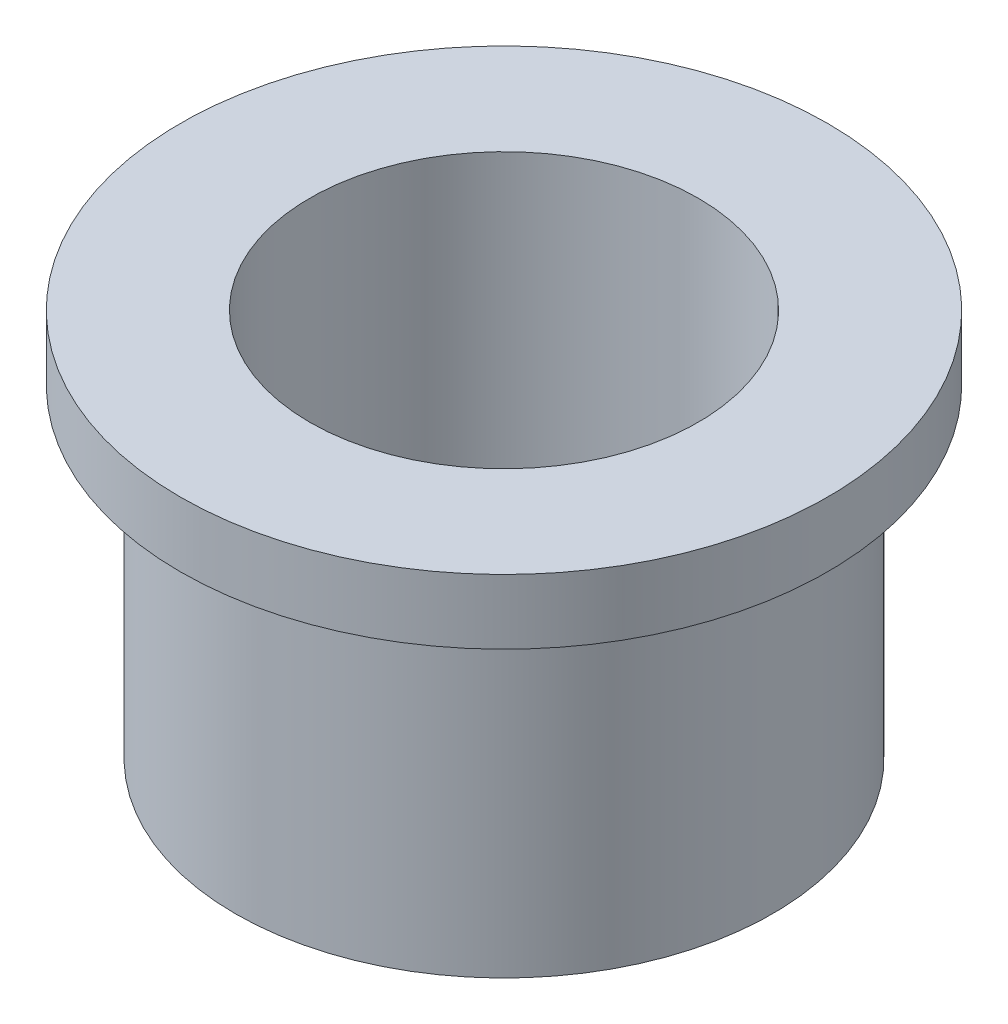
ISO-10303-21;
HEADER;
FILE_DESCRIPTION(('STEP AP214'),'2;1');
FILE_NAME('part.step','',(''),(''),'','','');
FILE_SCHEMA(('AUTOMOTIVE_DESIGN { 1 0 10303 214 1 1 1 1 }'));
ENDSEC;
DATA;
#1=APPLICATION_CONTEXT('core data for automotive mechanical design processes');
#2=APPLICATION_PROTOCOL_DEFINITION('international standard','automotive_design',2000,#1);
#3=PRODUCT_CONTEXT('',#1,'mechanical');
#4=PRODUCT('Part','Part','',(#3));
#5=PRODUCT_RELATED_PRODUCT_CATEGORY('part','',(#4));
#6=PRODUCT_DEFINITION_FORMATION('','',#4);
#7=PRODUCT_DEFINITION_CONTEXT('part definition',#1,'design');
#8=PRODUCT_DEFINITION('design','',#6,#7);
#9=PRODUCT_DEFINITION_SHAPE('','',#8);
#10=(LENGTH_UNIT() NAMED_UNIT(*) SI_UNIT(.MILLI.,.METRE.));
#11=(NAMED_UNIT(*) PLANE_ANGLE_UNIT() SI_UNIT($,.RADIAN.));
#12=(NAMED_UNIT(*) SI_UNIT($,.STERADIAN.) SOLID_ANGLE_UNIT());
#13=UNCERTAINTY_MEASURE_WITH_UNIT(LENGTH_MEASURE(1.E-05),#10,'distance_accuracy_value','');
#14=(GEOMETRIC_REPRESENTATION_CONTEXT(3) GLOBAL_UNCERTAINTY_ASSIGNED_CONTEXT((#13)) GLOBAL_UNIT_ASSIGNED_CONTEXT((#10,
#11,#12)) REPRESENTATION_CONTEXT('',''));
#15=CARTESIAN_POINT('',(0.,0.,0.));
#16=DIRECTION('',(0.,0.,1.));
#17=DIRECTION('',(1.,0.,0.));
#18=AXIS2_PLACEMENT_3D('',#15,#16,#17);
#19=CARTESIAN_POINT('',(0.,2.54,0.));
#20=DIRECTION('',(0.,-1.,0.));
#21=DIRECTION('',(0.,0.,-1.));
#22=AXIS2_PLACEMENT_3D('',#19,#20,#21);
#23=PLANE('',#22);
#24=CARTESIAN_POINT('',(0.,2.54,0.));
#25=DIRECTION('',(0.,-1.,0.));
#26=DIRECTION('',(0.,0.,-1.));
#27=AXIS2_PLACEMENT_3D('',#24,#25,#26);
#28=CIRCLE('',#27,7.62);
#29=CARTESIAN_POINT('',(0.,2.54,-7.62));
#30=VERTEX_POINT('',#29);
#31=EDGE_CURVE('E42',#30,#30,#28,.F.);
#32=ORIENTED_EDGE('',*,*,#31,.F.);
#33=EDGE_LOOP('',(#32));
#34=FACE_BOUND('',#33,.T.);
#35=CARTESIAN_POINT('',(0.,2.53999999999999,0.));
#36=DIRECTION('',(0.,-1.,0.));
#37=DIRECTION('',(0.,0.,-1.));
#38=AXIS2_PLACEMENT_3D('',#35,#36,#37);
#39=CIRCLE('',#38,12.7);
#40=CARTESIAN_POINT('',(0.,2.53999999999999,-12.7));
#41=VERTEX_POINT('',#40);
#42=EDGE_CURVE('E10',#41,#41,#39,.T.);
#43=ORIENTED_EDGE('',*,*,#42,.F.);
#44=EDGE_LOOP('',(#43));
#45=FACE_BOUND('',#44,.T.);
#46=ADVANCED_FACE('F36',(#34,#45),#23,.F.);
#47=CARTESIAN_POINT('',(0.,-12.7,0.));
#48=DIRECTION('',(0.,1.,0.));
#49=DIRECTION('',(0.,0.,1.));
#50=AXIS2_PLACEMENT_3D('',#47,#48,#49);
#51=CYLINDRICAL_SURFACE('',#50,10.541);
#52=CARTESIAN_POINT('',(0.,-12.7,0.));
#53=DIRECTION('',(0.,-1.,0.));
#54=DIRECTION('',(0.,0.,-1.));
#55=AXIS2_PLACEMENT_3D('',#52,#53,#54);
#56=CIRCLE('',#55,10.541);
#57=CARTESIAN_POINT('',(0.,-12.7,-10.541));
#58=VERTEX_POINT('',#57);
#59=EDGE_CURVE('E54',#58,#58,#56,.T.);
#60=ORIENTED_EDGE('',*,*,#59,.F.);
#61=EDGE_LOOP('',(#60));
#62=FACE_BOUND('',#61,.T.);
#63=CARTESIAN_POINT('',(0.,0.,0.));
#64=DIRECTION('',(0.,-1.,0.));
#65=DIRECTION('',(0.,0.,-1.));
#66=AXIS2_PLACEMENT_3D('',#63,#64,#65);
#67=CIRCLE('',#66,10.541);
#68=CARTESIAN_POINT('',(0.,0.,-10.541));
#69=VERTEX_POINT('',#68);
#70=EDGE_CURVE('E46',#69,#69,#67,.T.);
#71=ORIENTED_EDGE('',*,*,#70,.T.);
#72=EDGE_LOOP('',(#71));
#73=FACE_BOUND('',#72,.T.);
#74=ADVANCED_FACE('F66',(#62,#73),#51,.T.);
#75=CARTESIAN_POINT('',(0.,-12.7,0.));
#76=DIRECTION('',(0.,-1.,0.));
#77=DIRECTION('',(0.,0.,-1.));
#78=AXIS2_PLACEMENT_3D('',#75,#76,#77);
#79=PLANE('',#78);
#80=ORIENTED_EDGE('',*,*,#59,.T.);
#81=EDGE_LOOP('',(#80));
#82=FACE_BOUND('',#81,.T.);
#83=CARTESIAN_POINT('',(0.,-12.7,0.));
#84=DIRECTION('',(0.,-1.,0.));
#85=DIRECTION('',(0.,0.,-1.));
#86=AXIS2_PLACEMENT_3D('',#83,#84,#85);
#87=CIRCLE('',#86,7.62);
#88=CARTESIAN_POINT('',(0.,-12.7,-7.62));
#89=VERTEX_POINT('',#88);
#90=EDGE_CURVE('E58',#89,#89,#87,.T.);
#91=ORIENTED_EDGE('',*,*,#90,.F.);
#92=EDGE_LOOP('',(#91));
#93=FACE_BOUND('',#92,.T.);
#94=ADVANCED_FACE('F64',(#82,#93),#79,.T.);
#95=CARTESIAN_POINT('',(0.,0.,0.));
#96=DIRECTION('',(0.,1.,0.));
#97=DIRECTION('',(0.,0.,1.));
#98=AXIS2_PLACEMENT_3D('',#95,#96,#97);
#99=CYLINDRICAL_SURFACE('',#98,7.62);
#100=ORIENTED_EDGE('',*,*,#31,.T.);
#101=EDGE_LOOP('',(#100));
#102=FACE_BOUND('',#101,.T.);
#103=ORIENTED_EDGE('',*,*,#90,.T.);
#104=EDGE_LOOP('',(#103));
#105=FACE_BOUND('',#104,.T.);
#106=ADVANCED_FACE('F62',(#102,#105),#99,.F.);
#107=CARTESIAN_POINT('',(0.,0.,0.));
#108=DIRECTION('',(0.,1.,0.));
#109=DIRECTION('',(0.,0.,1.));
#110=AXIS2_PLACEMENT_3D('',#107,#108,#109);
#111=PLANE('',#110);
#112=ORIENTED_EDGE('',*,*,#70,.F.);
#113=EDGE_LOOP('',(#112));
#114=FACE_BOUND('',#113,.T.);
#115=CARTESIAN_POINT('',(0.,0.,0.));
#116=DIRECTION('',(0.,1.,0.));
#117=DIRECTION('',(0.,0.,1.));
#118=AXIS2_PLACEMENT_3D('',#115,#116,#117);
#119=CIRCLE('',#118,12.7);
#120=CARTESIAN_POINT('',(0.,0.,12.7));
#121=VERTEX_POINT('',#120);
#122=EDGE_CURVE('E50',#121,#121,#119,.T.);
#123=ORIENTED_EDGE('',*,*,#122,.F.);
#124=EDGE_LOOP('',(#123));
#125=FACE_BOUND('',#124,.T.);
#126=ADVANCED_FACE('F75',(#114,#125),#111,.F.);
#127=CARTESIAN_POINT('',(0.,177.8,0.));
#128=DIRECTION('',(0.,-1.,0.));
#129=DIRECTION('',(0.,0.,-1.));
#130=AXIS2_PLACEMENT_3D('',#127,#128,#129);
#131=CYLINDRICAL_SURFACE('',#130,12.7);
#132=ORIENTED_EDGE('',*,*,#42,.T.);
#133=EDGE_LOOP('',(#132));
#134=FACE_BOUND('',#133,.T.);
#135=ORIENTED_EDGE('',*,*,#122,.T.);
#136=EDGE_LOOP('',(#135));
#137=FACE_BOUND('',#136,.T.);
#138=ADVANCED_FACE('F81',(#134,#137),#131,.T.);
#139=CLOSED_SHELL('',(#46,#74,#94,#106,#126,#138));
#140=MANIFOLD_SOLID_BREP('B2',#139);
#141=ADVANCED_BREP_SHAPE_REPRESENTATION('',(#18,#140),#14);
#142=SHAPE_DEFINITION_REPRESENTATION(#9,#141);
ENDSEC;
END-ISO-10303-21;
